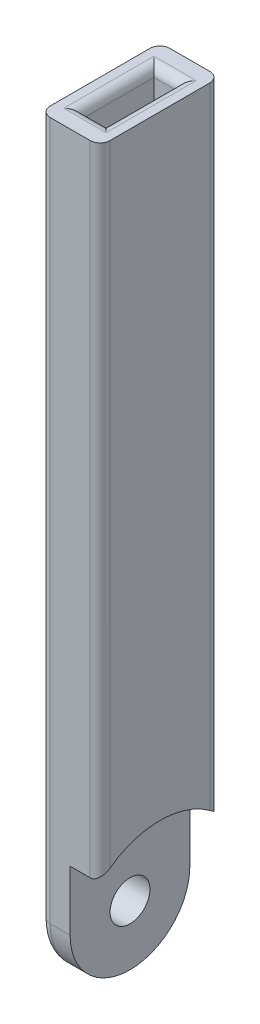
ISO-10303-21;
HEADER;
FILE_DESCRIPTION(('STEP AP214'),'2;1');
FILE_NAME('part.step','',(''),(''),'','','');
FILE_SCHEMA(('AUTOMOTIVE_DESIGN { 1 0 10303 214 1 1 1 1 }'));
ENDSEC;
DATA;
#1=APPLICATION_CONTEXT('core data for automotive mechanical design processes');
#2=APPLICATION_PROTOCOL_DEFINITION('international standard','automotive_design',2000,#1);
#3=PRODUCT_CONTEXT('',#1,'mechanical');
#4=PRODUCT('Part','Part','',(#3));
#5=PRODUCT_RELATED_PRODUCT_CATEGORY('part','',(#4));
#6=PRODUCT_DEFINITION_FORMATION('','',#4);
#7=PRODUCT_DEFINITION_CONTEXT('part definition',#1,'design');
#8=PRODUCT_DEFINITION('design','',#6,#7);
#9=PRODUCT_DEFINITION_SHAPE('','',#8);
#10=(LENGTH_UNIT() NAMED_UNIT(*) SI_UNIT(.MILLI.,.METRE.));
#11=(NAMED_UNIT(*) PLANE_ANGLE_UNIT() SI_UNIT($,.RADIAN.));
#12=(NAMED_UNIT(*) SI_UNIT($,.STERADIAN.) SOLID_ANGLE_UNIT());
#13=UNCERTAINTY_MEASURE_WITH_UNIT(LENGTH_MEASURE(1.E-05),#10,'distance_accuracy_value','');
#14=(GEOMETRIC_REPRESENTATION_CONTEXT(3) GLOBAL_UNCERTAINTY_ASSIGNED_CONTEXT((#13)) GLOBAL_UNIT_ASSIGNED_CONTEXT((#10,
#11,#12)) REPRESENTATION_CONTEXT('',''));
#15=CARTESIAN_POINT('',(0.,0.,0.));
#16=DIRECTION('',(0.,0.,1.));
#17=DIRECTION('',(1.,0.,0.));
#18=AXIS2_PLACEMENT_3D('',#15,#16,#17);
#19=CARTESIAN_POINT('',(76.805,-60.,-20.));
#20=DIRECTION('',(0.,-1.,0.));
#21=DIRECTION('',(-1.,0.,0.));
#22=AXIS2_PLACEMENT_3D('',#19,#20,#21);
#23=PLANE('',#22);
#24=DIRECTION('',(0.,0.,1.));
#25=VECTOR('',#24,1.);
#26=CARTESIAN_POINT('',(76.805,-60.,-20.));
#27=LINE('',#26,#25);
#28=CARTESIAN_POINT('',(76.8050000000001,-60.,-17.5));
#29=VERTEX_POINT('',#28);
#30=CARTESIAN_POINT('',(76.8050000000007,-60.,7.49999999999998));
#31=VERTEX_POINT('',#30);
#32=EDGE_CURVE('E263',#29,#31,#27,.T.);
#33=ORIENTED_EDGE('',*,*,#32,.T.);
#34=CARTESIAN_POINT('',(79.3050000000007,-60.,7.49999999999992));
#35=DIRECTION('',(0.,-1.,0.));
#36=DIRECTION('',(-1.,0.,0.));
#37=AXIS2_PLACEMENT_3D('',#34,#35,#36);
#38=CIRCLE('',#37,2.5);
#39=CARTESIAN_POINT('',(79.3050000000008,-60.,9.99999999999992));
#40=VERTEX_POINT('',#39);
#41=EDGE_CURVE('E297',#31,#40,#38,.F.);
#42=ORIENTED_EDGE('',*,*,#41,.T.);
#43=DIRECTION('',(1.,0.,0.));
#44=VECTOR('',#43,1.);
#45=CARTESIAN_POINT('',(76.8050000000008,-60.,9.99999999999998));
#46=LINE('',#45,#44);
#47=CARTESIAN_POINT('',(89.3050000000008,-60.,9.99999999999965));
#48=VERTEX_POINT('',#47);
#49=EDGE_CURVE('E252',#40,#48,#46,.T.);
#50=ORIENTED_EDGE('',*,*,#49,.T.);
#51=CARTESIAN_POINT('',(89.3050000000007,-60.,7.49999999999965));
#52=DIRECTION('',(0.,-1.,0.));
#53=DIRECTION('',(-1.,0.,0.));
#54=AXIS2_PLACEMENT_3D('',#51,#52,#53);
#55=CIRCLE('',#54,2.5);
#56=CARTESIAN_POINT('',(91.8050000000007,-60.,7.49999999999958));
#57=VERTEX_POINT('',#56);
#58=EDGE_CURVE('E295',#48,#57,#55,.F.);
#59=ORIENTED_EDGE('',*,*,#58,.T.);
#60=DIRECTION('',(0.,0.,1.));
#61=VECTOR('',#60,1.);
#62=CARTESIAN_POINT('',(91.805,-60.,-20.0000000000004));
#63=LINE('',#62,#61);
#64=CARTESIAN_POINT('',(91.805,-60.,-17.5000000000004));
#65=VERTEX_POINT('',#64);
#66=EDGE_CURVE('E258',#65,#57,#63,.T.);
#67=ORIENTED_EDGE('',*,*,#66,.F.);
#68=CARTESIAN_POINT('',(89.3050000000001,-60.,-17.5000000000003));
#69=DIRECTION('',(0.,-1.,0.));
#70=DIRECTION('',(-1.,0.,0.));
#71=AXIS2_PLACEMENT_3D('',#68,#69,#70);
#72=CIRCLE('',#71,2.5);
#73=CARTESIAN_POINT('',(89.305,-60.,-20.0000000000003));
#74=VERTEX_POINT('',#73);
#75=EDGE_CURVE('E291',#65,#74,#72,.F.);
#76=ORIENTED_EDGE('',*,*,#75,.T.);
#77=DIRECTION('',(1.,0.,0.));
#78=VECTOR('',#77,1.);
#79=CARTESIAN_POINT('',(76.805,-60.,-20.));
#80=LINE('',#79,#78);
#81=CARTESIAN_POINT('',(79.305,-60.,-20.0000000000001));
#82=VERTEX_POINT('',#81);
#83=EDGE_CURVE('E255',#82,#74,#80,.T.);
#84=ORIENTED_EDGE('',*,*,#83,.F.);
#85=CARTESIAN_POINT('',(79.3050000000001,-60.,-17.5000000000001));
#86=DIRECTION('',(0.,-1.,0.));
#87=DIRECTION('',(-1.,0.,0.));
#88=AXIS2_PLACEMENT_3D('',#85,#86,#87);
#89=CIRCLE('',#88,2.5);
#90=EDGE_CURVE('E293',#82,#29,#89,.F.);
#91=ORIENTED_EDGE('',*,*,#90,.T.);
#92=EDGE_LOOP('',(#33,#42,#50,#59,#67,#76,#84,#91));
#93=FACE_BOUND('',#92,.T.);
#94=DIRECTION('',(-1.,0.,0.));
#95=VECTOR('',#94,1.);
#96=CARTESIAN_POINT('',(0.,-60.,-16.3000000000002));
#97=LINE('',#96,#95);
#98=CARTESIAN_POINT('',(89.605,-60.,-16.3000000000002));
#99=VERTEX_POINT('',#98);
#100=CARTESIAN_POINT('',(79.005,-60.,-16.3000000000002));
#101=VERTEX_POINT('',#100);
#102=EDGE_CURVE('E201',#99,#101,#97,.T.);
#103=ORIENTED_EDGE('',*,*,#102,.F.);
#104=DIRECTION('',(0.,0.,-1.));
#105=VECTOR('',#104,1.);
#106=CARTESIAN_POINT('',(89.605,-60.,0.));
#107=LINE('',#106,#105);
#108=CARTESIAN_POINT('',(89.605,-60.,6.29999999999982));
#109=VERTEX_POINT('',#108);
#110=EDGE_CURVE('E198',#109,#99,#107,.T.);
#111=ORIENTED_EDGE('',*,*,#110,.F.);
#112=DIRECTION('',(-1.,0.,0.));
#113=VECTOR('',#112,1.);
#114=CARTESIAN_POINT('',(87.305,-60.,6.29999999999982));
#115=LINE('',#114,#113);
#116=CARTESIAN_POINT('',(79.005,-60.,6.29999999999982));
#117=VERTEX_POINT('',#116);
#118=EDGE_CURVE('E210',#117,#109,#115,.F.);
#119=ORIENTED_EDGE('',*,*,#118,.F.);
#120=DIRECTION('',(0.,0.,-1.));
#121=VECTOR('',#120,1.);
#122=CARTESIAN_POINT('',(79.005,-60.,3.99999999999982));
#123=LINE('',#122,#121);
#124=EDGE_CURVE('E208',#101,#117,#123,.F.);
#125=ORIENTED_EDGE('',*,*,#124,.F.);
#126=EDGE_LOOP('',(#103,#111,#119,#125));
#127=FACE_BOUND('',#126,.T.);
#128=ADVANCED_FACE('F36',(#93,#127),#23,.F.);
#129=CARTESIAN_POINT('',(103.257702702704,-220.,9.99999999999928));
#130=DIRECTION('',(0.,-1.,0.));
#131=DIRECTION('',(-1.,0.,0.));
#132=AXIS2_PLACEMENT_3D('',#129,#130,#131);
#133=PLANE('',#132);
#134=DIRECTION('',(-1.,0.,0.));
#135=VECTOR('',#134,1.);
#136=CARTESIAN_POINT('',(114.305000000001,-220.,9.94745986927476));
#137=LINE('',#136,#135);
#138=CARTESIAN_POINT('',(84.3050000000008,-220.,9.94745986927555));
#139=VERTEX_POINT('',#138);
#140=CARTESIAN_POINT('',(89.8148432977744,-220.,9.9474598692754));
#141=VERTEX_POINT('',#140);
#142=EDGE_CURVE('E279',#139,#141,#137,.F.);
#143=ORIENTED_EDGE('',*,*,#142,.T.);
#144=CARTESIAN_POINT('',(89.3050000000007,-220.,7.49999999999965));
#145=DIRECTION('',(0.,-1.,0.));
#146=DIRECTION('',(-1.,0.,0.));
#147=AXIS2_PLACEMENT_3D('',#144,#145,#146);
#148=CIRCLE('',#147,2.5);
#149=CARTESIAN_POINT('',(89.3050000000008,-220.,9.99999999999965));
#150=VERTEX_POINT('',#149);
#151=EDGE_CURVE('E415',#141,#150,#148,.T.);
#152=ORIENTED_EDGE('',*,*,#151,.T.);
#153=DIRECTION('',(-1.,0.,0.));
#154=VECTOR('',#153,1.);
#155=CARTESIAN_POINT('',(91.8050000000008,-220.,9.99999999999959));
#156=LINE('',#155,#154);
#157=CARTESIAN_POINT('',(84.3050000000008,-220.,9.99999999999979));
#158=VERTEX_POINT('',#157);
#159=EDGE_CURVE('E240',#150,#158,#156,.T.);
#160=ORIENTED_EDGE('',*,*,#159,.T.);
#161=DIRECTION('',(0.,0.,-1.));
#162=VECTOR('',#161,1.);
#163=CARTESIAN_POINT('',(84.305,-220.,-20.0000000000002));
#164=LINE('',#163,#162);
#165=EDGE_CURVE('E243',#158,#139,#164,.T.);
#166=ORIENTED_EDGE('',*,*,#165,.T.);
#167=EDGE_LOOP('',(#143,#152,#160,#166));
#168=FACE_BOUND('',#167,.T.);
#169=ADVANCED_FACE('F342',(#168),#133,.T.);
#170=DIRECTION('',(1.,0.,0.));
#171=VECTOR('',#170,1.);
#172=CARTESIAN_POINT('',(91.805,-220.,-20.0000000000004));
#173=LINE('',#172,#171);
#174=CARTESIAN_POINT('',(84.305,-220.,-20.0000000000002));
#175=VERTEX_POINT('',#174);
#176=CARTESIAN_POINT('',(89.305,-220.,-20.0000000000003));
#177=VERTEX_POINT('',#176);
#178=EDGE_CURVE('E246',#175,#177,#173,.T.);
#179=ORIENTED_EDGE('',*,*,#178,.T.);
#180=CARTESIAN_POINT('',(89.305,-220.,-17.5000000000003));
#181=DIRECTION('',(0.,-1.,0.));
#182=DIRECTION('',(-1.,0.,0.));
#183=AXIS2_PLACEMENT_3D('',#180,#181,#182);
#184=CIRCLE('',#183,2.5);
#185=CARTESIAN_POINT('',(89.8148432977736,-220.,-19.9474598692761));
#186=VERTEX_POINT('',#185);
#187=EDGE_CURVE('E11',#177,#186,#184,.T.);
#188=ORIENTED_EDGE('',*,*,#187,.T.);
#189=DIRECTION('',(-1.,0.,0.));
#190=VECTOR('',#189,1.);
#191=CARTESIAN_POINT('',(114.305,-220.,-19.9474598692768));
#192=LINE('',#191,#190);
#193=CARTESIAN_POINT('',(84.305,-220.,-19.947459869276));
#194=VERTEX_POINT('',#193);
#195=EDGE_CURVE('E276',#186,#194,#192,.T.);
#196=ORIENTED_EDGE('',*,*,#195,.T.);
#197=EDGE_CURVE('E242',#194,#175,#164,.T.);
#198=ORIENTED_EDGE('',*,*,#197,.T.);
#199=EDGE_LOOP('',(#179,#188,#196,#198));
#200=FACE_BOUND('',#199,.T.);
#201=ADVANCED_FACE('F345',(#200),#133,.T.);
#202=CARTESIAN_POINT('',(91.805,-250.,-20.0000000000004));
#203=DIRECTION('',(-1.,0.,0.));
#204=DIRECTION('',(0.,1.,0.));
#205=AXIS2_PLACEMENT_3D('',#202,#203,#204);
#206=PLANE('',#205);
#207=ORIENTED_EDGE('',*,*,#66,.T.);
#208=DIRECTION('',(0.,-1.,0.));
#209=VECTOR('',#208,1.);
#210=CARTESIAN_POINT('',(91.8050000000007,-250.,7.49999999999958));
#211=LINE('',#210,#209);
#212=CARTESIAN_POINT('',(91.8050000000007,-217.906827194941,7.49999999999958));
#213=VERTEX_POINT('',#212);
#214=EDGE_CURVE('E309',#57,#213,#211,.T.);
#215=ORIENTED_EDGE('',*,*,#214,.T.);
#216=CARTESIAN_POINT('',(91.8050000000004,-235.,-5.00000000000041));
#217=DIRECTION('',(-1.,0.,0.));
#218=DIRECTION('',(0.,1.,0.));
#219=AXIS2_PLACEMENT_3D('',#216,#217,#218);
#220=CIRCLE('',#219,21.176084542323);
#221=CARTESIAN_POINT('',(91.805,-217.906827194941,-17.5000000000004));
#222=VERTEX_POINT('',#221);
#223=EDGE_CURVE('E230',#222,#213,#220,.F.);
#224=ORIENTED_EDGE('',*,*,#223,.F.);
#225=DIRECTION('',(0.,-1.,0.));
#226=VECTOR('',#225,1.);
#227=CARTESIAN_POINT('',(91.805,-60.,-17.5000000000004));
#228=LINE('',#227,#226);
#229=EDGE_CURVE('E307',#222,#65,#228,.F.);
#230=ORIENTED_EDGE('',*,*,#229,.T.);
#231=EDGE_LOOP('',(#207,#215,#224,#230));
#232=FACE_BOUND('',#231,.T.);
#233=ADVANCED_FACE('F364',(#232),#206,.F.);
#234=CARTESIAN_POINT('',(76.8049999999999,-250.,-20.));
#235=DIRECTION('',(1.,0.,0.));
#236=DIRECTION('',(0.,-1.,0.));
#237=AXIS2_PLACEMENT_3D('',#234,#235,#236);
#238=PLANE('',#237);
#239=CARTESIAN_POINT('',(76.8050000000004,-235.,-5.00000000000002));
#240=DIRECTION('',(1.,0.,0.));
#241=DIRECTION('',(0.,-1.,0.));
#242=AXIS2_PLACEMENT_3D('',#239,#240,#241);
#243=CIRCLE('',#242,5.);
#244=CARTESIAN_POINT('',(76.8050000000004,-240.,-5.00000000000002));
#245=VERTEX_POINT('',#244);
#246=EDGE_CURVE('E237',#245,#245,#243,.T.);
#247=ORIENTED_EDGE('',*,*,#246,.T.);
#248=EDGE_LOOP('',(#247));
#249=FACE_BOUND('',#248,.T.);
#250=CARTESIAN_POINT('',(76.8050000000004,-235.,-5.00000000000002));
#251=DIRECTION('',(1.,0.,0.));
#252=DIRECTION('',(0.,-1.,0.));
#253=AXIS2_PLACEMENT_3D('',#250,#251,#252);
#254=CIRCLE('',#253,12.5);
#255=CARTESIAN_POINT('',(76.8050000000004,-247.5,-5.00000000000002));
#256=VERTEX_POINT('',#255);
#257=CARTESIAN_POINT('',(76.8050000000007,-235.,7.49999999999998));
#258=VERTEX_POINT('',#257);
#259=EDGE_CURVE('E286',#256,#258,#254,.F.);
#260=ORIENTED_EDGE('',*,*,#259,.T.);
#261=DIRECTION('',(0.,1.,0.));
#262=VECTOR('',#261,1.);
#263=CARTESIAN_POINT('',(76.8050000000007,-250.,7.49999999999998));
#264=LINE('',#263,#262);
#265=EDGE_CURVE('E288',#258,#31,#264,.T.);
#266=ORIENTED_EDGE('',*,*,#265,.T.);
#267=ORIENTED_EDGE('',*,*,#32,.F.);
#268=DIRECTION('',(0.,1.,0.));
#269=VECTOR('',#268,1.);
#270=CARTESIAN_POINT('',(76.805,-235.,-17.5));
#271=LINE('',#270,#269);
#272=CARTESIAN_POINT('',(76.805,-235.,-17.5));
#273=VERTEX_POINT('',#272);
#274=EDGE_CURVE('E282',#29,#273,#271,.F.);
#275=ORIENTED_EDGE('',*,*,#274,.T.);
#276=CARTESIAN_POINT('',(76.8050000000004,-235.,-5.00000000000002));
#277=DIRECTION('',(1.,0.,0.));
#278=DIRECTION('',(0.,-1.,0.));
#279=AXIS2_PLACEMENT_3D('',#276,#277,#278);
#280=CIRCLE('',#279,12.5);
#281=EDGE_CURVE('E284',#273,#256,#280,.F.);
#282=ORIENTED_EDGE('',*,*,#281,.T.);
#283=EDGE_LOOP('',(#260,#266,#267,#275,#282));
#284=FACE_BOUND('',#283,.T.);
#285=ADVANCED_FACE('F354',(#249,#284),#238,.F.);
#286=CARTESIAN_POINT('',(103.257702702703,-220.101351351351,-20.0000000000007));
#287=DIRECTION('',(0.,0.,-1.));
#288=DIRECTION('',(0.,1.,0.));
#289=AXIS2_PLACEMENT_3D('',#286,#287,#288);
#290=PLANE('',#289);
#291=DIRECTION('',(-1.,0.,0.));
#292=VECTOR('',#291,1.);
#293=CARTESIAN_POINT('',(76.8049999999999,-235.,-20.));
#294=LINE('',#293,#292);
#295=CARTESIAN_POINT('',(84.305,-235.,-20.0000000000002));
#296=VERTEX_POINT('',#295);
#297=CARTESIAN_POINT('',(79.305,-235.,-20.0000000000001));
#298=VERTEX_POINT('',#297);
#299=EDGE_CURVE('E273',#296,#298,#294,.T.);
#300=ORIENTED_EDGE('',*,*,#299,.T.);
#301=DIRECTION('',(0.,1.,0.));
#302=VECTOR('',#301,1.);
#303=CARTESIAN_POINT('',(79.305,-60.,-20.0000000000001));
#304=LINE('',#303,#302);
#305=EDGE_CURVE('E46',#298,#82,#304,.T.);
#306=ORIENTED_EDGE('',*,*,#305,.T.);
#307=ORIENTED_EDGE('',*,*,#83,.T.);
#308=DIRECTION('',(0.,-1.,0.));
#309=VECTOR('',#308,1.);
#310=CARTESIAN_POINT('',(89.305,-220.,-20.0000000000003));
#311=LINE('',#310,#309);
#312=EDGE_CURVE('E406',#74,#177,#311,.T.);
#313=ORIENTED_EDGE('',*,*,#312,.T.);
#314=ORIENTED_EDGE('',*,*,#178,.F.);
#315=DIRECTION('',(0.,-1.,0.));
#316=VECTOR('',#315,1.);
#317=CARTESIAN_POINT('',(84.305,-220.,-20.0000000000002));
#318=LINE('',#317,#316);
#319=EDGE_CURVE('E250',#175,#296,#318,.T.);
#320=ORIENTED_EDGE('',*,*,#319,.T.);
#321=EDGE_LOOP('',(#300,#306,#307,#313,#314,#320));
#322=FACE_BOUND('',#321,.T.);
#323=ADVANCED_FACE('F351',(#322),#290,.T.);
#324=CARTESIAN_POINT('',(103.257702702704,-220.101351351351,9.99999999999928));
#325=DIRECTION('',(0.,0.,-1.));
#326=DIRECTION('',(0.,1.,0.));
#327=AXIS2_PLACEMENT_3D('',#324,#325,#326);
#328=PLANE('',#327);
#329=ORIENTED_EDGE('',*,*,#49,.F.);
#330=DIRECTION('',(0.,1.,0.));
#331=VECTOR('',#330,1.);
#332=CARTESIAN_POINT('',(79.3050000000008,-220.101351351351,9.99999999999992));
#333=LINE('',#332,#331);
#334=CARTESIAN_POINT('',(79.3050000000008,-235.,9.99999999999992));
#335=VERTEX_POINT('',#334);
#336=EDGE_CURVE('E301',#40,#335,#333,.F.);
#337=ORIENTED_EDGE('',*,*,#336,.T.);
#338=DIRECTION('',(-1.,0.,0.));
#339=VECTOR('',#338,1.);
#340=CARTESIAN_POINT('',(103.257702702704,-235.,9.99999999999928));
#341=LINE('',#340,#339);
#342=CARTESIAN_POINT('',(84.3050000000008,-235.,9.99999999999979));
#343=VERTEX_POINT('',#342);
#344=EDGE_CURVE('E265',#335,#343,#341,.F.);
#345=ORIENTED_EDGE('',*,*,#344,.T.);
#346=DIRECTION('',(0.,-1.,0.));
#347=VECTOR('',#346,1.);
#348=CARTESIAN_POINT('',(84.3050000000008,-220.,9.99999999999979));
#349=LINE('',#348,#347);
#350=EDGE_CURVE('E249',#158,#343,#349,.T.);
#351=ORIENTED_EDGE('',*,*,#350,.F.);
#352=ORIENTED_EDGE('',*,*,#159,.F.);
#353=DIRECTION('',(0.,-1.,0.));
#354=VECTOR('',#353,1.);
#355=CARTESIAN_POINT('',(89.3050000000008,-220.101351351351,9.99999999999965));
#356=LINE('',#355,#354);
#357=EDGE_CURVE('E299',#150,#48,#356,.F.);
#358=ORIENTED_EDGE('',*,*,#357,.T.);
#359=EDGE_LOOP('',(#329,#337,#345,#351,#352,#358));
#360=FACE_BOUND('',#359,.T.);
#361=ADVANCED_FACE('F349',(#360),#328,.F.);
#362=CARTESIAN_POINT('',(84.305,-220.,-20.0000000000002));
#363=DIRECTION('',(-1.,0.,0.));
#364=DIRECTION('',(0.,1.,0.));
#365=AXIS2_PLACEMENT_3D('',#362,#363,#364);
#366=PLANE('',#365);
#367=ORIENTED_EDGE('',*,*,#197,.F.);
#368=CARTESIAN_POINT('',(84.3050000000004,-235.,-5.00000000000021));
#369=DIRECTION('',(1.,0.,0.));
#370=DIRECTION('',(0.,-1.,0.));
#371=AXIS2_PLACEMENT_3D('',#368,#369,#370);
#372=CIRCLE('',#371,21.176084542323);
#373=EDGE_CURVE('E228',#194,#139,#372,.T.);
#374=ORIENTED_EDGE('',*,*,#373,.T.);
#375=ORIENTED_EDGE('',*,*,#165,.F.);
#376=ORIENTED_EDGE('',*,*,#350,.T.);
#377=CARTESIAN_POINT('',(84.3050000000004,-235.,-5.00000000000021));
#378=DIRECTION('',(-1.,0.,0.));
#379=DIRECTION('',(0.,1.,0.));
#380=AXIS2_PLACEMENT_3D('',#377,#378,#379);
#381=CIRCLE('',#380,15.);
#382=CARTESIAN_POINT('',(84.3050000000004,-250.,-5.00000000000021));
#383=VERTEX_POINT('',#382);
#384=EDGE_CURVE('E270',#343,#383,#381,.F.);
#385=ORIENTED_EDGE('',*,*,#384,.T.);
#386=CARTESIAN_POINT('',(84.3050000000004,-235.,-5.00000000000021));
#387=DIRECTION('',(-1.,0.,0.));
#388=DIRECTION('',(0.,1.,0.));
#389=AXIS2_PLACEMENT_3D('',#386,#387,#388);
#390=CIRCLE('',#389,15.);
#391=EDGE_CURVE('E267',#383,#296,#390,.F.);
#392=ORIENTED_EDGE('',*,*,#391,.T.);
#393=ORIENTED_EDGE('',*,*,#319,.F.);
#394=EDGE_LOOP('',(#367,#374,#375,#376,#385,#392,#393));
#395=FACE_BOUND('',#394,.T.);
#396=CARTESIAN_POINT('',(84.3050000000004,-235.,-5.00000000000021));
#397=DIRECTION('',(1.,0.,0.));
#398=DIRECTION('',(0.,-1.,0.));
#399=AXIS2_PLACEMENT_3D('',#396,#397,#398);
#400=CIRCLE('',#399,5.);
#401=CARTESIAN_POINT('',(84.3050000000004,-240.,-5.00000000000021));
#402=VERTEX_POINT('',#401);
#403=EDGE_CURVE('E234',#402,#402,#400,.T.);
#404=ORIENTED_EDGE('',*,*,#403,.F.);
#405=EDGE_LOOP('',(#404));
#406=FACE_BOUND('',#405,.T.);
#407=ADVANCED_FACE('F340',(#395,#406),#366,.F.);
#408=CARTESIAN_POINT('',(54.3050000000004,-235.,-4.99999999999941));
#409=DIRECTION('',(1.,0.,0.));
#410=DIRECTION('',(0.,-1.,0.));
#411=AXIS2_PLACEMENT_3D('',#408,#409,#410);
#412=CYLINDRICAL_SURFACE('',#411,5.);
#413=ORIENTED_EDGE('',*,*,#403,.T.);
#414=EDGE_LOOP('',(#413));
#415=FACE_BOUND('',#414,.T.);
#416=ORIENTED_EDGE('',*,*,#246,.F.);
#417=EDGE_LOOP('',(#416));
#418=FACE_BOUND('',#417,.T.);
#419=ADVANCED_FACE('F335',(#415,#418),#412,.F.);
#420=CARTESIAN_POINT('',(103.257702702703,-235.,-5.00000000000072));
#421=DIRECTION('',(1.,0.,0.));
#422=DIRECTION('',(0.,-1.,0.));
#423=AXIS2_PLACEMENT_3D('',#420,#421,#422);
#424=CYLINDRICAL_SURFACE('',#423,15.);
#425=DIRECTION('',(-1.,0.,0.));
#426=VECTOR('',#425,1.);
#427=CARTESIAN_POINT('',(84.3050000000004,-250.,-5.00000000000021));
#428=LINE('',#427,#426);
#429=CARTESIAN_POINT('',(79.3050000000004,-250.,-5.00000000000008));
#430=VERTEX_POINT('',#429);
#431=EDGE_CURVE('E233',#430,#383,#428,.F.);
#432=ORIENTED_EDGE('',*,*,#431,.F.);
#433=CARTESIAN_POINT('',(79.3050000000004,-235.,-5.00000000000008));
#434=DIRECTION('',(1.,0.,0.));
#435=DIRECTION('',(0.,-1.,0.));
#436=AXIS2_PLACEMENT_3D('',#433,#434,#435);
#437=CIRCLE('',#436,15.);
#438=EDGE_CURVE('E305',#430,#298,#437,.T.);
#439=ORIENTED_EDGE('',*,*,#438,.T.);
#440=ORIENTED_EDGE('',*,*,#299,.F.);
#441=ORIENTED_EDGE('',*,*,#391,.F.);
#442=EDGE_LOOP('',(#432,#439,#440,#441));
#443=FACE_BOUND('',#442,.T.);
#444=ADVANCED_FACE('F339',(#443),#424,.T.);
#445=CARTESIAN_POINT('',(76.8050000000004,-235.,-5.00000000000002));
#446=DIRECTION('',(-1.,0.,0.));
#447=DIRECTION('',(0.,1.,0.));
#448=AXIS2_PLACEMENT_3D('',#445,#446,#447);
#449=CYLINDRICAL_SURFACE('',#448,15.);
#450=ORIENTED_EDGE('',*,*,#344,.F.);
#451=CARTESIAN_POINT('',(79.3050000000004,-235.,-5.00000000000008));
#452=DIRECTION('',(1.,0.,0.));
#453=DIRECTION('',(0.,-1.,0.));
#454=AXIS2_PLACEMENT_3D('',#451,#452,#453);
#455=CIRCLE('',#454,15.);
#456=EDGE_CURVE('E303',#335,#430,#455,.T.);
#457=ORIENTED_EDGE('',*,*,#456,.T.);
#458=ORIENTED_EDGE('',*,*,#431,.T.);
#459=ORIENTED_EDGE('',*,*,#384,.F.);
#460=EDGE_LOOP('',(#450,#457,#458,#459));
#461=FACE_BOUND('',#460,.T.);
#462=ADVANCED_FACE('F331',(#461),#449,.T.);
#463=CARTESIAN_POINT('',(114.305,-235.,-5.00000000000101));
#464=DIRECTION('',(-1.,0.,0.));
#465=DIRECTION('',(0.,1.,0.));
#466=AXIS2_PLACEMENT_3D('',#463,#464,#465);
#467=CYLINDRICAL_SURFACE('',#466,21.176084542323);
#468=ORIENTED_EDGE('',*,*,#223,.T.);
#469=CARTESIAN_POINT('',(91.8050000000007,-217.906827194941,7.49999999999958));
#470=CARTESIAN_POINT('',(91.8049909812939,-217.969230269731,7.58534475595648));
#471=CARTESIAN_POINT('',(91.8006300283351,-218.032270591453,7.67019693177997));
#472=CARTESIAN_POINT('',(91.7834362249737,-218.159180101918,7.83839416959189));
#473=CARTESIAN_POINT('',(91.7706045706877,-218.22304917239,7.92173944265767));
#474=CARTESIAN_POINT('',(91.7365925651988,-218.351599019963,8.08695301423051));
#475=CARTESIAN_POINT('',(91.7153592370716,-218.416282375854,8.16880842425116));
#476=CARTESIAN_POINT('',(91.6647138404015,-218.545560895145,8.32999204156911));
#477=CARTESIAN_POINT('',(91.6353012833133,-218.610156053044,8.40932009759204));
#478=CARTESIAN_POINT('',(91.532470381772,-218.80784078018,8.64859634728502));
#479=CARTESIAN_POINT('',(91.4456900411847,-218.94008142351,8.80375156949313));
#480=CARTESIAN_POINT('',(91.237332874027,-219.196278391719,9.09633195954223));
#481=CARTESIAN_POINT('',(91.1158308269463,-219.320251821343,9.23379431915856));
#482=CARTESIAN_POINT('',(90.8873318697069,-219.509760658949,9.43921959953835));
#483=CARTESIAN_POINT('',(90.79088759289,-219.580255038556,9.51437594887657));
#484=CARTESIAN_POINT('',(90.5835049585445,-219.710908762401,9.65193348870798));
#485=CARTESIAN_POINT('',(90.4726313067109,-219.771111623247,9.71438860897547));
#486=CARTESIAN_POINT('',(90.2714481985492,-219.861688490758,9.80746519756088));
#487=CARTESIAN_POINT('',(90.1845970559922,-219.895638234719,9.84205591596288));
#488=CARTESIAN_POINT('',(90.0043175606646,-219.95487877468,9.90210151129456));
#489=CARTESIAN_POINT('',(89.9108492654266,-219.980110412055,9.92749402590192));
#490=CARTESIAN_POINT('',(89.8148432977744,-220.,9.9474598692754));
#491=B_SPLINE_CURVE_WITH_KNOTS('',3,(#469,#470,#471,#472,#473,#474,#475,#476,#477,#478,#479,
#480,#481,#482,#483,#484,#485,#486,#487,#488,#489,#490),.UNSPECIFIED.,.F.,.F.,(4,2,2,2,2,2,2,2,
2,2,4),(0.,0.317051425084096,0.63405809007319,0.953096341918463,1.27215365400817,
1.93343726213751,2.59330727295348,3.01537270814065,3.43560679782219,3.73304196742586,
4.03245753846565),.UNSPECIFIED.);
#492=EDGE_CURVE('E319',#213,#141,#491,.T.);
#493=ORIENTED_EDGE('',*,*,#492,.T.);
#494=ORIENTED_EDGE('',*,*,#142,.F.);
#495=ORIENTED_EDGE('',*,*,#373,.F.);
#496=ORIENTED_EDGE('',*,*,#195,.F.);
#497=CARTESIAN_POINT('',(89.8148432977736,-220.,-19.9474598692761));
#498=CARTESIAN_POINT('',(89.8788233897045,-219.986728085639,-19.934139356223));
#499=CARTESIAN_POINT('',(89.941734729238,-219.971085945501,-19.9184088180793));
#500=CARTESIAN_POINT('',(90.0649375152675,-219.935585026362,-19.8825605307815));
#501=CARTESIAN_POINT('',(90.1252336917988,-219.915734278362,-19.8624511355522));
#502=CARTESIAN_POINT('',(90.3004788298475,-219.851062738214,-19.796621064992));
#503=CARTESIAN_POINT('',(90.4112725170731,-219.80079358295,-19.7450724326243));
#504=CARTESIAN_POINT('',(90.6428982076878,-219.677385130874,-19.6168917021407));
#505=CARTESIAN_POINT('',(90.7606204570755,-219.601648357828,-19.5372390167345));
#506=CARTESIAN_POINT('',(90.977342472866,-219.439461299538,-19.3635107291716));
#507=CARTESIAN_POINT('',(91.0762399046592,-219.352956460074,-19.2693610599342));
#508=CARTESIAN_POINT('',(91.2812202273549,-219.147285810371,-19.0409368361628));
#509=CARTESIAN_POINT('',(91.3809950794636,-219.025949508031,-18.90296571267));
#510=CARTESIAN_POINT('',(91.5495809231179,-218.778552582424,-18.613504635883));
#511=CARTESIAN_POINT('',(91.6184110295318,-218.652494927865,-18.4620230976032));
#512=CARTESIAN_POINT('',(91.7155652009409,-218.421919705913,-18.176544667337));
#513=CARTESIAN_POINT('',(91.7488802959933,-218.317507526352,-18.044149706676));
#514=CARTESIAN_POINT('',(91.7824083729506,-218.162187015046,-17.8421893694028));
#515=CARTESIAN_POINT('',(91.7908434006647,-218.110679111002,-17.7743753081247));
#516=CARTESIAN_POINT('',(91.8021372761251,-218.00825475928,-17.6378183023387));
#517=CARTESIAN_POINT('',(91.804994794964,-217.957338455429,-17.5690751403891));
#518=CARTESIAN_POINT('',(91.805,-217.906827194941,-17.5000000000004));
#519=B_SPLINE_CURVE_WITH_KNOTS('',3,(#497,#498,#499,#500,#501,#502,#503,#504,#505,#506,#507,
#508,#509,#510,#511,#512,#513,#514,#515,#516,#517,#518),.UNSPECIFIED.,.F.,.F.,(4,2,2,2,2,2,2,2,
2,2,4),(0.,0.199847288032907,0.399316599302321,0.793656678193498,1.2742995200971,
1.75748492228141,2.38150989694564,3.00514887394758,3.51925506785214,3.77581121796463,
4.03242848815572),.UNSPECIFIED.);
#520=EDGE_CURVE('E312',#186,#222,#519,.T.);
#521=ORIENTED_EDGE('',*,*,#520,.T.);
#522=EDGE_LOOP('',(#468,#493,#494,#495,#496,#521));
#523=FACE_BOUND('',#522,.T.);
#524=ADVANCED_FACE('F325',(#523),#467,.F.);
#525=CARTESIAN_POINT('',(79.305,-220.101351351351,-17.5000000000001));
#526=DIRECTION('',(0.,-1.,0.));
#527=DIRECTION('',(-1.,0.,0.));
#528=AXIS2_PLACEMENT_3D('',#525,#526,#527);
#529=CYLINDRICAL_SURFACE('',#528,2.5);
#530=ORIENTED_EDGE('',*,*,#90,.F.);
#531=ORIENTED_EDGE('',*,*,#305,.F.);
#532=CARTESIAN_POINT('',(79.305,-235.,-17.5000000000001));
#533=DIRECTION('',(0.,-1.,0.));
#534=DIRECTION('',(-1.,0.,0.));
#535=AXIS2_PLACEMENT_3D('',#532,#533,#534);
#536=CIRCLE('',#535,2.5);
#537=EDGE_CURVE('E41',#273,#298,#536,.T.);
#538=ORIENTED_EDGE('',*,*,#537,.F.);
#539=ORIENTED_EDGE('',*,*,#274,.F.);
#540=EDGE_LOOP('',(#530,#531,#538,#539));
#541=FACE_BOUND('',#540,.T.);
#542=ADVANCED_FACE('F330',(#541),#529,.T.);
#543=CARTESIAN_POINT('',(79.3050000000004,-235.,-5.00000000000008));
#544=DIRECTION('',(1.,0.,0.));
#545=DIRECTION('',(0.,-1.,0.));
#546=AXIS2_PLACEMENT_3D('',#543,#544,#545);
#547=TOROIDAL_SURFACE('',#546,12.5,2.5);
#548=ORIENTED_EDGE('',*,*,#537,.T.);
#549=ORIENTED_EDGE('',*,*,#438,.F.);
#550=CARTESIAN_POINT('',(79.3050000000004,-247.5,-5.00000000000008));
#551=DIRECTION('',(0.,0.,1.));
#552=DIRECTION('',(0.,-1.,0.));
#553=AXIS2_PLACEMENT_3D('',#550,#551,#552);
#554=CIRCLE('',#553,2.5);
#555=EDGE_CURVE('E419',#256,#430,#554,.T.);
#556=ORIENTED_EDGE('',*,*,#555,.F.);
#557=ORIENTED_EDGE('',*,*,#281,.F.);
#558=EDGE_LOOP('',(#548,#549,#556,#557));
#559=FACE_BOUND('',#558,.T.);
#560=ADVANCED_FACE('F383',(#559),#547,.T.);
#561=CARTESIAN_POINT('',(79.3050000000004,-235.,-5.00000000000008));
#562=DIRECTION('',(1.,0.,0.));
#563=DIRECTION('',(0.,-1.,0.));
#564=AXIS2_PLACEMENT_3D('',#561,#562,#563);
#565=TOROIDAL_SURFACE('',#564,12.5,2.5);
#566=ORIENTED_EDGE('',*,*,#555,.T.);
#567=ORIENTED_EDGE('',*,*,#456,.F.);
#568=CARTESIAN_POINT('',(79.3050000000007,-235.,7.49999999999992));
#569=DIRECTION('',(0.,1.,0.));
#570=DIRECTION('',(1.,0.,0.));
#571=AXIS2_PLACEMENT_3D('',#568,#569,#570);
#572=CIRCLE('',#571,2.5);
#573=EDGE_CURVE('E219',#258,#335,#572,.T.);
#574=ORIENTED_EDGE('',*,*,#573,.F.);
#575=ORIENTED_EDGE('',*,*,#259,.F.);
#576=EDGE_LOOP('',(#566,#567,#574,#575));
#577=FACE_BOUND('',#576,.T.);
#578=ADVANCED_FACE('F379',(#577),#565,.T.);
#579=CARTESIAN_POINT('',(79.3050000000007,-250.,7.49999999999992));
#580=DIRECTION('',(0.,1.,0.));
#581=DIRECTION('',(1.,0.,0.));
#582=AXIS2_PLACEMENT_3D('',#579,#580,#581);
#583=CYLINDRICAL_SURFACE('',#582,2.5);
#584=ORIENTED_EDGE('',*,*,#573,.T.);
#585=ORIENTED_EDGE('',*,*,#336,.F.);
#586=ORIENTED_EDGE('',*,*,#41,.F.);
#587=ORIENTED_EDGE('',*,*,#265,.F.);
#588=EDGE_LOOP('',(#584,#585,#586,#587));
#589=FACE_BOUND('',#588,.T.);
#590=ADVANCED_FACE('F375',(#589),#583,.T.);
#591=CARTESIAN_POINT('',(89.3050000000007,-250.,7.49999999999965));
#592=DIRECTION('',(0.,-1.,0.));
#593=DIRECTION('',(-1.,0.,0.));
#594=AXIS2_PLACEMENT_3D('',#591,#592,#593);
#595=CYLINDRICAL_SURFACE('',#594,2.5);
#596=ORIENTED_EDGE('',*,*,#58,.F.);
#597=ORIENTED_EDGE('',*,*,#357,.F.);
#598=ORIENTED_EDGE('',*,*,#151,.F.);
#599=ORIENTED_EDGE('',*,*,#492,.F.);
#600=ORIENTED_EDGE('',*,*,#214,.F.);
#601=EDGE_LOOP('',(#596,#597,#598,#599,#600));
#602=FACE_BOUND('',#601,.T.);
#603=ADVANCED_FACE('F378',(#602),#595,.T.);
#604=CARTESIAN_POINT('',(89.305,-220.101351351351,-17.5000000000003));
#605=DIRECTION('',(0.,1.,0.));
#606=DIRECTION('',(1.,0.,0.));
#607=AXIS2_PLACEMENT_3D('',#604,#605,#606);
#608=CYLINDRICAL_SURFACE('',#607,2.5);
#609=ORIENTED_EDGE('',*,*,#75,.F.);
#610=ORIENTED_EDGE('',*,*,#229,.F.);
#611=ORIENTED_EDGE('',*,*,#520,.F.);
#612=ORIENTED_EDGE('',*,*,#187,.F.);
#613=ORIENTED_EDGE('',*,*,#312,.F.);
#614=EDGE_LOOP('',(#609,#610,#611,#612,#613));
#615=FACE_BOUND('',#614,.T.);
#616=ADVANCED_FACE('F38',(#615),#608,.T.);
#617=CARTESIAN_POINT('',(87.305,-80.,3.99999999999982));
#618=DIRECTION('',(0.,0.,-1.));
#619=DIRECTION('',(-1.,0.,0.));
#620=AXIS2_PLACEMENT_3D('',#617,#618,#619);
#621=PLANE('',#620);
#622=DIRECTION('',(0.,1.,0.));
#623=VECTOR('',#622,1.);
#624=CARTESIAN_POINT('',(87.305,-80.,3.99999999999982));
#625=LINE('',#624,#623);
#626=CARTESIAN_POINT('',(87.305,-80.,3.99999999999982));
#627=VERTEX_POINT('',#626);
#628=CARTESIAN_POINT('',(87.305,-62.3,3.99999999999982));
#629=VERTEX_POINT('',#628);
#630=EDGE_CURVE('E192',#627,#629,#625,.T.);
#631=ORIENTED_EDGE('',*,*,#630,.F.);
#632=DIRECTION('',(-1.,0.,0.));
#633=VECTOR('',#632,1.);
#634=CARTESIAN_POINT('',(87.305,-80.,3.99999999999982));
#635=LINE('',#634,#633);
#636=CARTESIAN_POINT('',(81.305,-80.,3.99999999999982));
#637=VERTEX_POINT('',#636);
#638=EDGE_CURVE('E177',#627,#637,#635,.T.);
#639=ORIENTED_EDGE('',*,*,#638,.T.);
#640=DIRECTION('',(0.,1.,0.));
#641=VECTOR('',#640,1.);
#642=CARTESIAN_POINT('',(81.305,-80.,3.99999999999982));
#643=LINE('',#642,#641);
#644=CARTESIAN_POINT('',(81.305,-62.3,3.99999999999982));
#645=VERTEX_POINT('',#644);
#646=EDGE_CURVE('E190',#637,#645,#643,.T.);
#647=ORIENTED_EDGE('',*,*,#646,.T.);
#648=DIRECTION('',(-1.,0.,0.));
#649=VECTOR('',#648,1.);
#650=CARTESIAN_POINT('',(81.305,-62.3,3.99999999999982));
#651=LINE('',#650,#649);
#652=EDGE_CURVE('E212',#629,#645,#651,.T.);
#653=ORIENTED_EDGE('',*,*,#652,.F.);
#654=EDGE_LOOP('',(#631,#639,#647,#653));
#655=FACE_BOUND('',#654,.T.);
#656=ADVANCED_FACE('F188',(#655),#621,.T.);
#657=CARTESIAN_POINT('',(81.305,-80.,3.99999999999982));
#658=DIRECTION('',(1.,0.,0.));
#659=DIRECTION('',(0.,0.,-1.));
#660=AXIS2_PLACEMENT_3D('',#657,#658,#659);
#661=PLANE('',#660);
#662=ORIENTED_EDGE('',*,*,#646,.F.);
#663=DIRECTION('',(0.,0.,-1.));
#664=VECTOR('',#663,1.);
#665=CARTESIAN_POINT('',(81.305,-80.,3.99999999999982));
#666=LINE('',#665,#664);
#667=CARTESIAN_POINT('',(81.305,-80.,-14.0000000000002));
#668=VERTEX_POINT('',#667);
#669=EDGE_CURVE('E173',#637,#668,#666,.T.);
#670=ORIENTED_EDGE('',*,*,#669,.T.);
#671=DIRECTION('',(0.,1.,0.));
#672=VECTOR('',#671,1.);
#673=CARTESIAN_POINT('',(81.305,-80.,-14.0000000000002));
#674=LINE('',#673,#672);
#675=CARTESIAN_POINT('',(81.305,-62.3,-14.0000000000002));
#676=VERTEX_POINT('',#675);
#677=EDGE_CURVE('E199',#668,#676,#674,.T.);
#678=ORIENTED_EDGE('',*,*,#677,.T.);
#679=DIRECTION('',(0.,0.,-1.));
#680=VECTOR('',#679,1.);
#681=CARTESIAN_POINT('',(81.305,-62.3,-14.0000000000002));
#682=LINE('',#681,#680);
#683=EDGE_CURVE('E197',#645,#676,#682,.T.);
#684=ORIENTED_EDGE('',*,*,#683,.F.);
#685=EDGE_LOOP('',(#662,#670,#678,#684));
#686=FACE_BOUND('',#685,.T.);
#687=ADVANCED_FACE('F196',(#686),#661,.T.);
#688=CARTESIAN_POINT('',(87.305,-80.,-14.0000000000002));
#689=DIRECTION('',(0.,0.,-1.));
#690=DIRECTION('',(-1.,0.,0.));
#691=AXIS2_PLACEMENT_3D('',#688,#689,#690);
#692=PLANE('',#691);
#693=ORIENTED_EDGE('',*,*,#677,.F.);
#694=DIRECTION('',(-1.,0.,0.));
#695=VECTOR('',#694,1.);
#696=CARTESIAN_POINT('',(87.305,-80.,-14.0000000000002));
#697=LINE('',#696,#695);
#698=CARTESIAN_POINT('',(87.305,-80.,-14.0000000000002));
#699=VERTEX_POINT('',#698);
#700=EDGE_CURVE('E180',#699,#668,#697,.T.);
#701=ORIENTED_EDGE('',*,*,#700,.F.);
#702=DIRECTION('',(0.,1.,0.));
#703=VECTOR('',#702,1.);
#704=CARTESIAN_POINT('',(87.305,-80.,-14.0000000000002));
#705=LINE('',#704,#703);
#706=CARTESIAN_POINT('',(87.305,-62.3,-14.0000000000002));
#707=VERTEX_POINT('',#706);
#708=EDGE_CURVE('E203',#699,#707,#705,.T.);
#709=ORIENTED_EDGE('',*,*,#708,.T.);
#710=DIRECTION('',(-1.,0.,0.));
#711=VECTOR('',#710,1.);
#712=CARTESIAN_POINT('',(87.305,-62.3,-14.0000000000002));
#713=LINE('',#712,#711);
#714=EDGE_CURVE('E215',#676,#707,#713,.F.);
#715=ORIENTED_EDGE('',*,*,#714,.F.);
#716=EDGE_LOOP('',(#693,#701,#709,#715));
#717=FACE_BOUND('',#716,.T.);
#718=ADVANCED_FACE('F513',(#717),#692,.F.);
#719=CARTESIAN_POINT('',(87.305,-80.,3.99999999999982));
#720=DIRECTION('',(1.,0.,0.));
#721=DIRECTION('',(0.,0.,-1.));
#722=AXIS2_PLACEMENT_3D('',#719,#720,#721);
#723=PLANE('',#722);
#724=ORIENTED_EDGE('',*,*,#708,.F.);
#725=DIRECTION('',(0.,0.,-1.));
#726=VECTOR('',#725,1.);
#727=CARTESIAN_POINT('',(87.305,-80.,3.99999999999982));
#728=LINE('',#727,#726);
#729=EDGE_CURVE('E669',#627,#699,#728,.T.);
#730=ORIENTED_EDGE('',*,*,#729,.F.);
#731=ORIENTED_EDGE('',*,*,#630,.T.);
#732=DIRECTION('',(0.,0.,-1.));
#733=VECTOR('',#732,1.);
#734=CARTESIAN_POINT('',(87.305,-62.3,3.99999999999982));
#735=LINE('',#734,#733);
#736=EDGE_CURVE('E217',#707,#629,#735,.F.);
#737=ORIENTED_EDGE('',*,*,#736,.F.);
#738=EDGE_LOOP('',(#724,#730,#731,#737));
#739=FACE_BOUND('',#738,.T.);
#740=ADVANCED_FACE('F521',(#739),#723,.F.);
#741=CARTESIAN_POINT('',(0.,-80.,0.));
#742=DIRECTION('',(0.,-1.,0.));
#743=DIRECTION('',(0.,0.,-1.));
#744=AXIS2_PLACEMENT_3D('',#741,#742,#743);
#745=PLANE('',#744);
#746=ORIENTED_EDGE('',*,*,#638,.F.);
#747=ORIENTED_EDGE('',*,*,#729,.T.);
#748=ORIENTED_EDGE('',*,*,#700,.T.);
#749=ORIENTED_EDGE('',*,*,#669,.F.);
#750=EDGE_LOOP('',(#746,#747,#748,#749));
#751=FACE_BOUND('',#750,.T.);
#752=ADVANCED_FACE('F175',(#751),#745,.F.);
#753=CARTESIAN_POINT('',(0.,-62.3,-16.3000000000002));
#754=DIRECTION('',(-1.,0.,0.));
#755=DIRECTION('',(0.,0.,1.));
#756=AXIS2_PLACEMENT_3D('',#753,#754,#755);
#757=CYLINDRICAL_SURFACE('',#756,2.3);
#758=CARTESIAN_POINT('',(79.005,-62.3,-16.3000000000002));
#759=DIRECTION('',(-0.707106781186547,0.,0.707106781186547));
#760=DIRECTION('',(-0.707106781186547,0.,-0.707106781186547));
#761=AXIS2_PLACEMENT_3D('',#758,#759,#760);
#762=ELLIPSE('',#761,3.25269119345812,2.3);
#763=EDGE_CURVE('E223',#101,#676,#762,.F.);
#764=ORIENTED_EDGE('',*,*,#763,.T.);
#765=ORIENTED_EDGE('',*,*,#714,.T.);
#766=CARTESIAN_POINT('',(89.605,-62.3,-16.3000000000002));
#767=DIRECTION('',(-0.707106781186547,0.,-0.707106781186547));
#768=DIRECTION('',(0.707106781186547,0.,-0.707106781186547));
#769=AXIS2_PLACEMENT_3D('',#766,#767,#768);
#770=ELLIPSE('',#769,3.25269119345812,2.3);
#771=EDGE_CURVE('E193',#707,#99,#770,.T.);
#772=ORIENTED_EDGE('',*,*,#771,.T.);
#773=ORIENTED_EDGE('',*,*,#102,.T.);
#774=EDGE_LOOP('',(#764,#765,#772,#773));
#775=FACE_BOUND('',#774,.T.);
#776=ADVANCED_FACE('F333',(#775),#757,.T.);
#777=CARTESIAN_POINT('',(89.605,-62.3,0.));
#778=DIRECTION('',(0.,0.,-1.));
#779=DIRECTION('',(-1.,0.,0.));
#780=AXIS2_PLACEMENT_3D('',#777,#778,#779);
#781=CYLINDRICAL_SURFACE('',#780,2.3);
#782=ORIENTED_EDGE('',*,*,#771,.F.);
#783=ORIENTED_EDGE('',*,*,#736,.T.);
#784=CARTESIAN_POINT('',(89.605,-62.3,6.29999999999982));
#785=DIRECTION('',(0.707106781186547,0.,-0.707106781186547));
#786=DIRECTION('',(-0.707106781186547,0.,-0.707106781186547));
#787=AXIS2_PLACEMENT_3D('',#784,#785,#786);
#788=ELLIPSE('',#787,3.25269119345812,2.3);
#789=EDGE_CURVE('E221',#629,#109,#788,.T.);
#790=ORIENTED_EDGE('',*,*,#789,.T.);
#791=ORIENTED_EDGE('',*,*,#110,.T.);
#792=EDGE_LOOP('',(#782,#783,#790,#791));
#793=FACE_BOUND('',#792,.T.);
#794=ADVANCED_FACE('F545',(#793),#781,.T.);
#795=CARTESIAN_POINT('',(79.005,-62.3,3.99999999999982));
#796=DIRECTION('',(0.,0.,1.));
#797=DIRECTION('',(1.,0.,0.));
#798=AXIS2_PLACEMENT_3D('',#795,#796,#797);
#799=CYLINDRICAL_SURFACE('',#798,2.3);
#800=ORIENTED_EDGE('',*,*,#763,.F.);
#801=ORIENTED_EDGE('',*,*,#124,.T.);
#802=CARTESIAN_POINT('',(79.005,-62.3,6.29999999999982));
#803=DIRECTION('',(0.707106781186547,0.,0.707106781186547));
#804=DIRECTION('',(-0.707106781186547,0.,0.707106781186547));
#805=AXIS2_PLACEMENT_3D('',#802,#803,#804);
#806=ELLIPSE('',#805,3.25269119345812,2.3);
#807=EDGE_CURVE('E54',#117,#645,#806,.F.);
#808=ORIENTED_EDGE('',*,*,#807,.T.);
#809=ORIENTED_EDGE('',*,*,#683,.T.);
#810=EDGE_LOOP('',(#800,#801,#808,#809));
#811=FACE_BOUND('',#810,.T.);
#812=ADVANCED_FACE('F553',(#811),#799,.T.);
#813=CARTESIAN_POINT('',(87.305,-62.3,6.29999999999982));
#814=DIRECTION('',(1.,0.,0.));
#815=DIRECTION('',(0.,0.,-1.));
#816=AXIS2_PLACEMENT_3D('',#813,#814,#815);
#817=CYLINDRICAL_SURFACE('',#816,2.3);
#818=ORIENTED_EDGE('',*,*,#789,.F.);
#819=ORIENTED_EDGE('',*,*,#652,.T.);
#820=ORIENTED_EDGE('',*,*,#807,.F.);
#821=ORIENTED_EDGE('',*,*,#118,.T.);
#822=EDGE_LOOP('',(#818,#819,#820,#821));
#823=FACE_BOUND('',#822,.T.);
#824=ADVANCED_FACE('F561',(#823),#817,.T.);
#825=CLOSED_SHELL('',(#128,#169,#201,#233,#285,#323,#361,#407,#419,#444,#462,#524,#542,#560,
#578,#590,#603,#616,#656,#687,#718,#740,#752,#776,#794,#812,#824));
#826=MANIFOLD_SOLID_BREP('B2',#825);
#827=ADVANCED_BREP_SHAPE_REPRESENTATION('',(#18,#826),#14);
#828=SHAPE_DEFINITION_REPRESENTATION(#9,#827);
ENDSEC;
END-ISO-10303-21;
